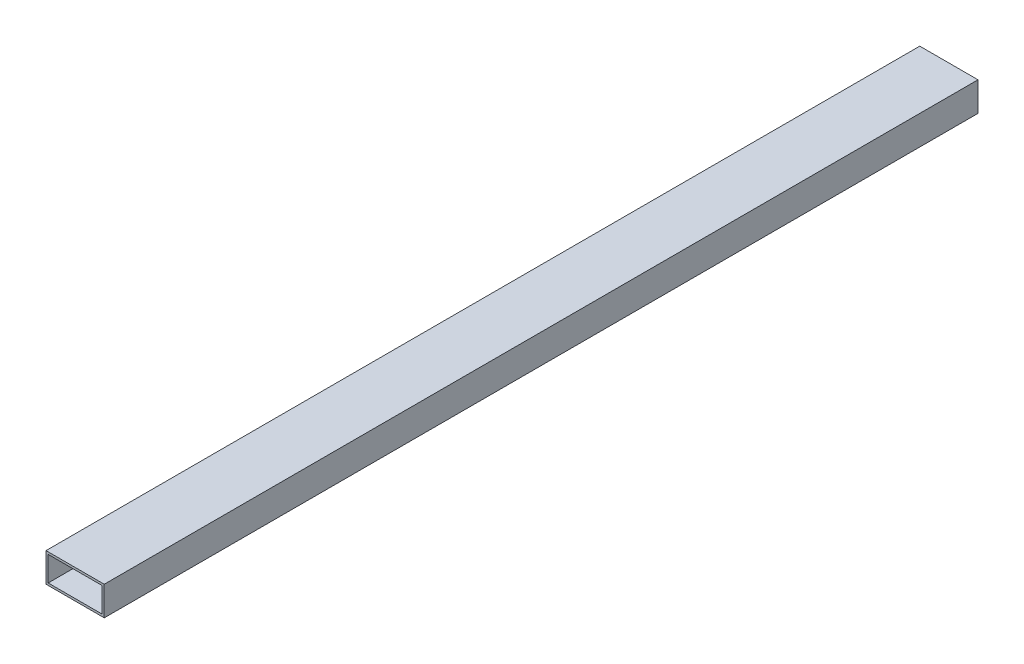
ISO-10303-21;
HEADER;
FILE_DESCRIPTION(('STEP AP214'),'2;1');
FILE_NAME('part.step','',(''),(''),'','','');
FILE_SCHEMA(('AUTOMOTIVE_DESIGN { 1 0 10303 214 1 1 1 1 }'));
ENDSEC;
DATA;
#1=APPLICATION_CONTEXT('core data for automotive mechanical design processes');
#2=APPLICATION_PROTOCOL_DEFINITION('international standard','automotive_design',2000,#1);
#3=PRODUCT_CONTEXT('',#1,'mechanical');
#4=PRODUCT('Part','Part','',(#3));
#5=PRODUCT_RELATED_PRODUCT_CATEGORY('part','',(#4));
#6=PRODUCT_DEFINITION_FORMATION('','',#4);
#7=PRODUCT_DEFINITION_CONTEXT('part definition',#1,'design');
#8=PRODUCT_DEFINITION('design','',#6,#7);
#9=PRODUCT_DEFINITION_SHAPE('','',#8);
#10=(LENGTH_UNIT() NAMED_UNIT(*) SI_UNIT(.MILLI.,.METRE.));
#11=(NAMED_UNIT(*) PLANE_ANGLE_UNIT() SI_UNIT($,.RADIAN.));
#12=(NAMED_UNIT(*) SI_UNIT($,.STERADIAN.) SOLID_ANGLE_UNIT());
#13=UNCERTAINTY_MEASURE_WITH_UNIT(LENGTH_MEASURE(1.E-05),#10,'distance_accuracy_value','');
#14=(GEOMETRIC_REPRESENTATION_CONTEXT(3) GLOBAL_UNCERTAINTY_ASSIGNED_CONTEXT((#13)) GLOBAL_UNIT_ASSIGNED_CONTEXT((#10,
#11,#12)) REPRESENTATION_CONTEXT('',''));
#15=CARTESIAN_POINT('',(0.,0.,0.));
#16=DIRECTION('',(0.,0.,1.));
#17=DIRECTION('',(1.,0.,0.));
#18=AXIS2_PLACEMENT_3D('',#15,#16,#17);
#19=CARTESIAN_POINT('',(0.,0.,600.));
#20=DIRECTION('',(0.,0.,1.));
#21=DIRECTION('',(1.,0.,0.));
#22=AXIS2_PLACEMENT_3D('',#19,#20,#21);
#23=PLANE('',#22);
#24=DIRECTION('',(0.,-1.,0.));
#25=VECTOR('',#24,1.);
#26=CARTESIAN_POINT('',(-20.,20.,600.));
#27=LINE('',#26,#25);
#28=CARTESIAN_POINT('',(-20.,20.,600.));
#29=VERTEX_POINT('',#28);
#30=CARTESIAN_POINT('',(-20.,0.,600.));
#31=VERTEX_POINT('',#30);
#32=EDGE_CURVE('E136',#29,#31,#27,.T.);
#33=ORIENTED_EDGE('',*,*,#32,.T.);
#34=DIRECTION('',(1.,0.,0.));
#35=VECTOR('',#34,1.);
#36=CARTESIAN_POINT('',(-20.,0.,600.));
#37=LINE('',#36,#35);
#38=CARTESIAN_POINT('',(20.,0.,600.));
#39=VERTEX_POINT('',#38);
#40=EDGE_CURVE('E139',#31,#39,#37,.T.);
#41=ORIENTED_EDGE('',*,*,#40,.T.);
#42=DIRECTION('',(0.,1.,0.));
#43=VECTOR('',#42,1.);
#44=CARTESIAN_POINT('',(20.,0.,600.));
#45=LINE('',#44,#43);
#46=CARTESIAN_POINT('',(20.,20.,600.));
#47=VERTEX_POINT('',#46);
#48=EDGE_CURVE('E142',#39,#47,#45,.T.);
#49=ORIENTED_EDGE('',*,*,#48,.T.);
#50=DIRECTION('',(-1.,0.,0.));
#51=VECTOR('',#50,1.);
#52=CARTESIAN_POINT('',(20.,20.,600.));
#53=LINE('',#52,#51);
#54=EDGE_CURVE('E144',#47,#29,#53,.T.);
#55=ORIENTED_EDGE('',*,*,#54,.T.);
#56=EDGE_LOOP('',(#33,#41,#49,#55));
#57=FACE_BOUND('',#56,.T.);
#58=DIRECTION('',(1.,0.,0.));
#59=VECTOR('',#58,1.);
#60=CARTESIAN_POINT('',(18.5,1.50000000000001,600.));
#61=LINE('',#60,#59);
#62=CARTESIAN_POINT('',(-18.5,1.5,600.));
#63=VERTEX_POINT('',#62);
#64=CARTESIAN_POINT('',(18.5,1.50000000000001,600.));
#65=VERTEX_POINT('',#64);
#66=EDGE_CURVE('E108',#63,#65,#61,.T.);
#67=ORIENTED_EDGE('',*,*,#66,.F.);
#68=DIRECTION('',(0.,-1.,0.));
#69=VECTOR('',#68,1.);
#70=CARTESIAN_POINT('',(-18.5,1.5,600.));
#71=LINE('',#70,#69);
#72=CARTESIAN_POINT('',(-18.5,18.5,600.));
#73=VERTEX_POINT('',#72);
#74=EDGE_CURVE('E100',#73,#63,#71,.T.);
#75=ORIENTED_EDGE('',*,*,#74,.F.);
#76=DIRECTION('',(-1.,0.,0.));
#77=VECTOR('',#76,1.);
#78=CARTESIAN_POINT('',(-18.5,18.5,600.));
#79=LINE('',#78,#77);
#80=CARTESIAN_POINT('',(18.5,18.5,600.));
#81=VERTEX_POINT('',#80);
#82=EDGE_CURVE('E122',#81,#73,#79,.T.);
#83=ORIENTED_EDGE('',*,*,#82,.F.);
#84=DIRECTION('',(0.,1.,0.));
#85=VECTOR('',#84,1.);
#86=CARTESIAN_POINT('',(18.5,18.5,600.));
#87=LINE('',#86,#85);
#88=EDGE_CURVE('E120',#65,#81,#87,.T.);
#89=ORIENTED_EDGE('',*,*,#88,.F.);
#90=EDGE_LOOP('',(#67,#75,#83,#89));
#91=FACE_BOUND('',#90,.T.);
#92=ADVANCED_FACE('F35',(#57,#91),#23,.T.);
#93=CARTESIAN_POINT('',(0.,0.,0.));
#94=DIRECTION('',(0.,0.,1.));
#95=DIRECTION('',(1.,0.,0.));
#96=AXIS2_PLACEMENT_3D('',#93,#94,#95);
#97=PLANE('',#96);
#98=DIRECTION('',(0.,-1.,0.));
#99=VECTOR('',#98,1.);
#100=CARTESIAN_POINT('',(-20.,20.,0.));
#101=LINE('',#100,#99);
#102=CARTESIAN_POINT('',(-20.,20.,0.));
#103=VERTEX_POINT('',#102);
#104=CARTESIAN_POINT('',(-20.,0.,0.));
#105=VERTEX_POINT('',#104);
#106=EDGE_CURVE('E116',#103,#105,#101,.T.);
#107=ORIENTED_EDGE('',*,*,#106,.F.);
#108=DIRECTION('',(-1.,0.,0.));
#109=VECTOR('',#108,1.);
#110=CARTESIAN_POINT('',(20.,20.,0.));
#111=LINE('',#110,#109);
#112=CARTESIAN_POINT('',(20.,20.,0.));
#113=VERTEX_POINT('',#112);
#114=EDGE_CURVE('E140',#113,#103,#111,.T.);
#115=ORIENTED_EDGE('',*,*,#114,.F.);
#116=DIRECTION('',(0.,1.,0.));
#117=VECTOR('',#116,1.);
#118=CARTESIAN_POINT('',(20.,0.,0.));
#119=LINE('',#118,#117);
#120=CARTESIAN_POINT('',(20.,0.,0.));
#121=VERTEX_POINT('',#120);
#122=EDGE_CURVE('E151',#121,#113,#119,.T.);
#123=ORIENTED_EDGE('',*,*,#122,.F.);
#124=DIRECTION('',(1.,0.,0.));
#125=VECTOR('',#124,1.);
#126=CARTESIAN_POINT('',(-20.,0.,0.));
#127=LINE('',#126,#125);
#128=EDGE_CURVE('E149',#105,#121,#127,.T.);
#129=ORIENTED_EDGE('',*,*,#128,.F.);
#130=EDGE_LOOP('',(#107,#115,#123,#129));
#131=FACE_BOUND('',#130,.T.);
#132=DIRECTION('',(0.,-1.,0.));
#133=VECTOR('',#132,1.);
#134=CARTESIAN_POINT('',(-18.5,1.5,0.));
#135=LINE('',#134,#133);
#136=CARTESIAN_POINT('',(-18.5,18.5,0.));
#137=VERTEX_POINT('',#136);
#138=CARTESIAN_POINT('',(-18.5,1.5,0.));
#139=VERTEX_POINT('',#138);
#140=EDGE_CURVE('E58',#137,#139,#135,.T.);
#141=ORIENTED_EDGE('',*,*,#140,.T.);
#142=DIRECTION('',(1.,0.,0.));
#143=VECTOR('',#142,1.);
#144=CARTESIAN_POINT('',(18.5,1.50000000000001,0.));
#145=LINE('',#144,#143);
#146=CARTESIAN_POINT('',(18.5,1.50000000000001,0.));
#147=VERTEX_POINT('',#146);
#148=EDGE_CURVE('E115',#139,#147,#145,.T.);
#149=ORIENTED_EDGE('',*,*,#148,.T.);
#150=DIRECTION('',(0.,1.,0.));
#151=VECTOR('',#150,1.);
#152=CARTESIAN_POINT('',(18.5,18.5,0.));
#153=LINE('',#152,#151);
#154=CARTESIAN_POINT('',(18.5,18.5,0.));
#155=VERTEX_POINT('',#154);
#156=EDGE_CURVE('E128',#147,#155,#153,.T.);
#157=ORIENTED_EDGE('',*,*,#156,.T.);
#158=DIRECTION('',(-1.,0.,0.));
#159=VECTOR('',#158,1.);
#160=CARTESIAN_POINT('',(-18.5,18.5,0.));
#161=LINE('',#160,#159);
#162=EDGE_CURVE('E109',#155,#137,#161,.T.);
#163=ORIENTED_EDGE('',*,*,#162,.T.);
#164=EDGE_LOOP('',(#141,#149,#157,#163));
#165=FACE_BOUND('',#164,.T.);
#166=ADVANCED_FACE('F169',(#131,#165),#97,.F.);
#167=CARTESIAN_POINT('',(-20.,20.,600.));
#168=DIRECTION('',(1.,0.,0.));
#169=DIRECTION('',(0.,0.,-1.));
#170=AXIS2_PLACEMENT_3D('',#167,#168,#169);
#171=PLANE('',#170);
#172=ORIENTED_EDGE('',*,*,#106,.T.);
#173=DIRECTION('',(0.,0.,-1.));
#174=VECTOR('',#173,1.);
#175=CARTESIAN_POINT('',(-20.,0.,600.));
#176=LINE('',#175,#174);
#177=EDGE_CURVE('E11',#31,#105,#176,.T.);
#178=ORIENTED_EDGE('',*,*,#177,.F.);
#179=ORIENTED_EDGE('',*,*,#32,.F.);
#180=DIRECTION('',(0.,0.,-1.));
#181=VECTOR('',#180,1.);
#182=CARTESIAN_POINT('',(-20.,20.,600.));
#183=LINE('',#182,#181);
#184=EDGE_CURVE('E146',#29,#103,#183,.T.);
#185=ORIENTED_EDGE('',*,*,#184,.T.);
#186=EDGE_LOOP('',(#172,#178,#179,#185));
#187=FACE_BOUND('',#186,.T.);
#188=ADVANCED_FACE('F37',(#187),#171,.F.);
#189=CARTESIAN_POINT('',(-20.,0.,600.));
#190=DIRECTION('',(0.,1.,0.));
#191=DIRECTION('',(0.,0.,1.));
#192=AXIS2_PLACEMENT_3D('',#189,#190,#191);
#193=PLANE('',#192);
#194=ORIENTED_EDGE('',*,*,#128,.T.);
#195=DIRECTION('',(0.,0.,-1.));
#196=VECTOR('',#195,1.);
#197=CARTESIAN_POINT('',(20.,0.,600.));
#198=LINE('',#197,#196);
#199=EDGE_CURVE('E43',#39,#121,#198,.T.);
#200=ORIENTED_EDGE('',*,*,#199,.F.);
#201=ORIENTED_EDGE('',*,*,#40,.F.);
#202=ORIENTED_EDGE('',*,*,#177,.T.);
#203=EDGE_LOOP('',(#194,#200,#201,#202));
#204=FACE_BOUND('',#203,.T.);
#205=ADVANCED_FACE('F179',(#204),#193,.F.);
#206=CARTESIAN_POINT('',(20.,0.,600.));
#207=DIRECTION('',(-1.,0.,0.));
#208=DIRECTION('',(0.,0.,1.));
#209=AXIS2_PLACEMENT_3D('',#206,#207,#208);
#210=PLANE('',#209);
#211=ORIENTED_EDGE('',*,*,#122,.T.);
#212=DIRECTION('',(0.,0.,-1.));
#213=VECTOR('',#212,1.);
#214=CARTESIAN_POINT('',(20.,20.,600.));
#215=LINE('',#214,#213);
#216=EDGE_CURVE('E156',#47,#113,#215,.T.);
#217=ORIENTED_EDGE('',*,*,#216,.F.);
#218=ORIENTED_EDGE('',*,*,#48,.F.);
#219=ORIENTED_EDGE('',*,*,#199,.T.);
#220=EDGE_LOOP('',(#211,#217,#218,#219));
#221=FACE_BOUND('',#220,.T.);
#222=ADVANCED_FACE('F163',(#221),#210,.F.);
#223=CARTESIAN_POINT('',(20.,20.,600.));
#224=DIRECTION('',(0.,-1.,0.));
#225=DIRECTION('',(0.,0.,-1.));
#226=AXIS2_PLACEMENT_3D('',#223,#224,#225);
#227=PLANE('',#226);
#228=ORIENTED_EDGE('',*,*,#114,.T.);
#229=ORIENTED_EDGE('',*,*,#184,.F.);
#230=ORIENTED_EDGE('',*,*,#54,.F.);
#231=ORIENTED_EDGE('',*,*,#216,.T.);
#232=EDGE_LOOP('',(#228,#229,#230,#231));
#233=FACE_BOUND('',#232,.T.);
#234=ADVANCED_FACE('F173',(#233),#227,.F.);
#235=CARTESIAN_POINT('',(-18.5,1.5,600.));
#236=DIRECTION('',(1.,0.,0.));
#237=DIRECTION('',(0.,0.,-1.));
#238=AXIS2_PLACEMENT_3D('',#235,#236,#237);
#239=PLANE('',#238);
#240=ORIENTED_EDGE('',*,*,#140,.F.);
#241=DIRECTION('',(0.,0.,-1.));
#242=VECTOR('',#241,1.);
#243=CARTESIAN_POINT('',(-18.5,18.5,600.));
#244=LINE('',#243,#242);
#245=EDGE_CURVE('E104',#73,#137,#244,.T.);
#246=ORIENTED_EDGE('',*,*,#245,.F.);
#247=ORIENTED_EDGE('',*,*,#74,.T.);
#248=DIRECTION('',(0.,0.,-1.));
#249=VECTOR('',#248,1.);
#250=CARTESIAN_POINT('',(-18.5,1.5,600.));
#251=LINE('',#250,#249);
#252=EDGE_CURVE('E103',#63,#139,#251,.T.);
#253=ORIENTED_EDGE('',*,*,#252,.T.);
#254=EDGE_LOOP('',(#240,#246,#247,#253));
#255=FACE_BOUND('',#254,.T.);
#256=ADVANCED_FACE('F102',(#255),#239,.T.);
#257=CARTESIAN_POINT('',(18.5,1.50000000000001,600.));
#258=DIRECTION('',(0.,1.,0.));
#259=DIRECTION('',(-1.,0.,0.));
#260=AXIS2_PLACEMENT_3D('',#257,#258,#259);
#261=PLANE('',#260);
#262=ORIENTED_EDGE('',*,*,#148,.F.);
#263=ORIENTED_EDGE('',*,*,#252,.F.);
#264=ORIENTED_EDGE('',*,*,#66,.T.);
#265=DIRECTION('',(0.,0.,-1.));
#266=VECTOR('',#265,1.);
#267=CARTESIAN_POINT('',(18.5,1.50000000000001,600.));
#268=LINE('',#267,#266);
#269=EDGE_CURVE('E117',#65,#147,#268,.T.);
#270=ORIENTED_EDGE('',*,*,#269,.T.);
#271=EDGE_LOOP('',(#262,#263,#264,#270));
#272=FACE_BOUND('',#271,.T.);
#273=ADVANCED_FACE('F112',(#272),#261,.T.);
#274=CARTESIAN_POINT('',(18.5,18.5,600.));
#275=DIRECTION('',(-1.,0.,0.));
#276=DIRECTION('',(0.,-1.,0.));
#277=AXIS2_PLACEMENT_3D('',#274,#275,#276);
#278=PLANE('',#277);
#279=ORIENTED_EDGE('',*,*,#156,.F.);
#280=ORIENTED_EDGE('',*,*,#269,.F.);
#281=ORIENTED_EDGE('',*,*,#88,.T.);
#282=DIRECTION('',(0.,0.,-1.));
#283=VECTOR('',#282,1.);
#284=CARTESIAN_POINT('',(18.5,18.5,600.));
#285=LINE('',#284,#283);
#286=EDGE_CURVE('E50',#81,#155,#285,.T.);
#287=ORIENTED_EDGE('',*,*,#286,.T.);
#288=EDGE_LOOP('',(#279,#280,#281,#287));
#289=FACE_BOUND('',#288,.T.);
#290=ADVANCED_FACE('F202',(#289),#278,.T.);
#291=CARTESIAN_POINT('',(-18.5,18.5,600.));
#292=DIRECTION('',(0.,-1.,0.));
#293=DIRECTION('',(1.,0.,0.));
#294=AXIS2_PLACEMENT_3D('',#291,#292,#293);
#295=PLANE('',#294);
#296=ORIENTED_EDGE('',*,*,#162,.F.);
#297=ORIENTED_EDGE('',*,*,#286,.F.);
#298=ORIENTED_EDGE('',*,*,#82,.T.);
#299=ORIENTED_EDGE('',*,*,#245,.T.);
#300=EDGE_LOOP('',(#296,#297,#298,#299));
#301=FACE_BOUND('',#300,.T.);
#302=ADVANCED_FACE('F206',(#301),#295,.T.);
#303=CLOSED_SHELL('',(#92,#166,#188,#205,#222,#234,#256,#273,#290,#302));
#304=MANIFOLD_SOLID_BREP('B2',#303);
#305=ADVANCED_BREP_SHAPE_REPRESENTATION('',(#18,#304),#14);
#306=SHAPE_DEFINITION_REPRESENTATION(#9,#305);
ENDSEC;
END-ISO-10303-21;
